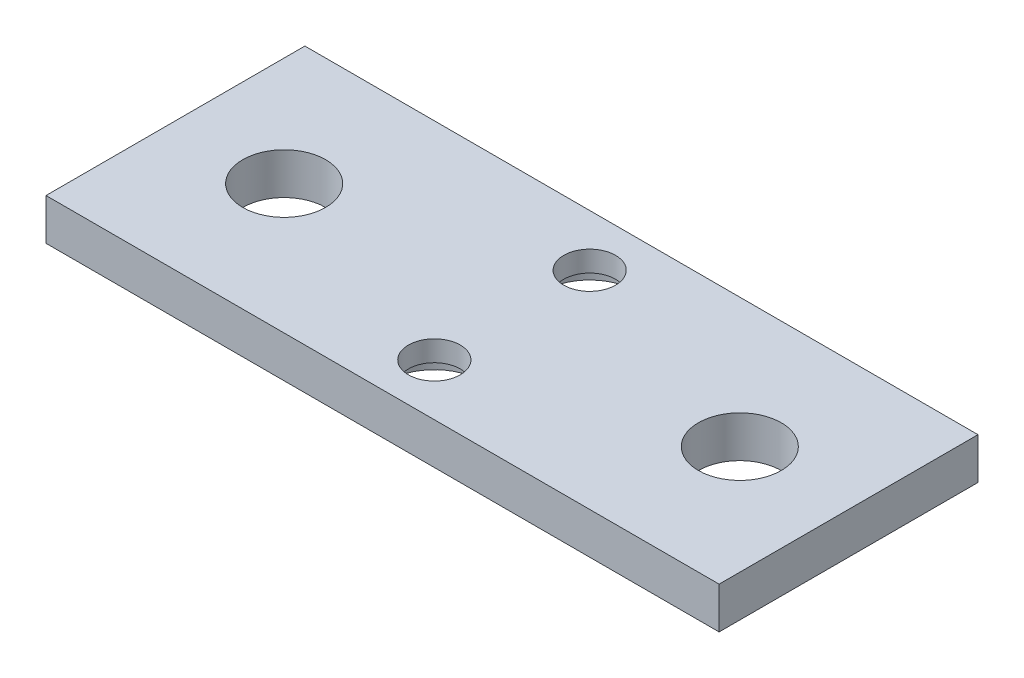
ISO-10303-21;
HEADER;
FILE_DESCRIPTION(('STEP AP214'),'2;1');
FILE_NAME('part.step','',(''),(''),'','','');
FILE_SCHEMA(('AUTOMOTIVE_DESIGN { 1 0 10303 214 1 1 1 1 }'));
ENDSEC;
DATA;
#1=APPLICATION_CONTEXT('core data for automotive mechanical design processes');
#2=APPLICATION_PROTOCOL_DEFINITION('international standard','automotive_design',2000,#1);
#3=PRODUCT_CONTEXT('',#1,'mechanical');
#4=PRODUCT('Part','Part','',(#3));
#5=PRODUCT_RELATED_PRODUCT_CATEGORY('part','',(#4));
#6=PRODUCT_DEFINITION_FORMATION('','',#4);
#7=PRODUCT_DEFINITION_CONTEXT('part definition',#1,'design');
#8=PRODUCT_DEFINITION('design','',#6,#7);
#9=PRODUCT_DEFINITION_SHAPE('','',#8);
#10=(LENGTH_UNIT() NAMED_UNIT(*) SI_UNIT(.MILLI.,.METRE.));
#11=(NAMED_UNIT(*) PLANE_ANGLE_UNIT() SI_UNIT($,.RADIAN.));
#12=(NAMED_UNIT(*) SI_UNIT($,.STERADIAN.) SOLID_ANGLE_UNIT());
#13=UNCERTAINTY_MEASURE_WITH_UNIT(LENGTH_MEASURE(1.E-05),#10,'distance_accuracy_value','');
#14=(GEOMETRIC_REPRESENTATION_CONTEXT(3) GLOBAL_UNCERTAINTY_ASSIGNED_CONTEXT((#13)) GLOBAL_UNIT_ASSIGNED_CONTEXT((#10,
#11,#12)) REPRESENTATION_CONTEXT('',''));
#15=CARTESIAN_POINT('',(0.,0.,0.));
#16=DIRECTION('',(0.,0.,1.));
#17=DIRECTION('',(1.,0.,0.));
#18=AXIS2_PLACEMENT_3D('',#15,#16,#17);
#19=CARTESIAN_POINT('',(-32.5,4.,-12.5));
#20=DIRECTION('',(0.,0.,1.));
#21=DIRECTION('',(1.,0.,0.));
#22=AXIS2_PLACEMENT_3D('',#19,#20,#21);
#23=PLANE('',#22);
#24=DIRECTION('',(0.,-1.,0.));
#25=VECTOR('',#24,1.);
#26=CARTESIAN_POINT('',(-32.5,4.,-12.5));
#27=LINE('',#26,#25);
#28=CARTESIAN_POINT('',(-32.5,4.,-12.5));
#29=VERTEX_POINT('',#28);
#30=CARTESIAN_POINT('',(-32.5,0.,-12.5));
#31=VERTEX_POINT('',#30);
#32=EDGE_CURVE('E50',#29,#31,#27,.T.);
#33=ORIENTED_EDGE('',*,*,#32,.F.);
#34=DIRECTION('',(-1.,0.,0.));
#35=VECTOR('',#34,1.);
#36=CARTESIAN_POINT('',(-32.5,4.,-12.5));
#37=LINE('',#36,#35);
#38=CARTESIAN_POINT('',(32.5,4.,-12.5));
#39=VERTEX_POINT('',#38);
#40=EDGE_CURVE('E89',#39,#29,#37,.T.);
#41=ORIENTED_EDGE('',*,*,#40,.F.);
#42=DIRECTION('',(0.,-1.,0.));
#43=VECTOR('',#42,1.);
#44=CARTESIAN_POINT('',(32.5,4.,-12.5));
#45=LINE('',#44,#43);
#46=CARTESIAN_POINT('',(32.5,0.,-12.5));
#47=VERTEX_POINT('',#46);
#48=EDGE_CURVE('E11',#39,#47,#45,.T.);
#49=ORIENTED_EDGE('',*,*,#48,.T.);
#50=DIRECTION('',(-1.,0.,0.));
#51=VECTOR('',#50,1.);
#52=CARTESIAN_POINT('',(-32.5,0.,-12.5));
#53=LINE('',#52,#51);
#54=EDGE_CURVE('E98',#47,#31,#53,.T.);
#55=ORIENTED_EDGE('',*,*,#54,.T.);
#56=EDGE_LOOP('',(#33,#41,#49,#55));
#57=FACE_BOUND('',#56,.T.);
#58=ADVANCED_FACE('F40',(#57),#23,.F.);
#59=CARTESIAN_POINT('',(-32.5,4.,12.5));
#60=DIRECTION('',(0.,0.,-1.));
#61=DIRECTION('',(-1.,0.,0.));
#62=AXIS2_PLACEMENT_3D('',#59,#60,#61);
#63=PLANE('',#62);
#64=DIRECTION('',(0.,-1.,0.));
#65=VECTOR('',#64,1.);
#66=CARTESIAN_POINT('',(32.5,4.,12.5));
#67=LINE('',#66,#65);
#68=CARTESIAN_POINT('',(32.5,4.,12.5));
#69=VERTEX_POINT('',#68);
#70=CARTESIAN_POINT('',(32.5,0.,12.5));
#71=VERTEX_POINT('',#70);
#72=EDGE_CURVE('E103',#69,#71,#67,.T.);
#73=ORIENTED_EDGE('',*,*,#72,.F.);
#74=DIRECTION('',(1.,0.,0.));
#75=VECTOR('',#74,1.);
#76=CARTESIAN_POINT('',(-32.5,4.,12.5));
#77=LINE('',#76,#75);
#78=CARTESIAN_POINT('',(-32.5,4.,12.5));
#79=VERTEX_POINT('',#78);
#80=EDGE_CURVE('E59',#79,#69,#77,.T.);
#81=ORIENTED_EDGE('',*,*,#80,.F.);
#82=DIRECTION('',(0.,-1.,0.));
#83=VECTOR('',#82,1.);
#84=CARTESIAN_POINT('',(-32.5,4.,12.5));
#85=LINE('',#84,#83);
#86=CARTESIAN_POINT('',(-32.5,0.,12.5));
#87=VERTEX_POINT('',#86);
#88=EDGE_CURVE('E99',#79,#87,#85,.T.);
#89=ORIENTED_EDGE('',*,*,#88,.T.);
#90=DIRECTION('',(1.,0.,0.));
#91=VECTOR('',#90,1.);
#92=CARTESIAN_POINT('',(-32.5,0.,12.5));
#93=LINE('',#92,#91);
#94=EDGE_CURVE('E82',#87,#71,#93,.T.);
#95=ORIENTED_EDGE('',*,*,#94,.T.);
#96=EDGE_LOOP('',(#73,#81,#89,#95));
#97=FACE_BOUND('',#96,.T.);
#98=ADVANCED_FACE('F167',(#97),#63,.F.);
#99=CARTESIAN_POINT('',(0.,17.,7.49999999999999));
#100=DIRECTION('',(0.,-1.,0.));
#101=DIRECTION('',(0.,0.,-1.));
#102=AXIS2_PLACEMENT_3D('',#99,#100,#101);
#103=CYLINDRICAL_SURFACE('',#102,2.5);
#104=CARTESIAN_POINT('',(0.,4.,7.49999999999999));
#105=DIRECTION('',(0.,-1.,0.));
#106=DIRECTION('',(0.,0.,-1.));
#107=AXIS2_PLACEMENT_3D('',#104,#105,#106);
#108=CIRCLE('',#107,2.5);
#109=CARTESIAN_POINT('',(0.,4.,4.99999999999999));
#110=VERTEX_POINT('',#109);
#111=EDGE_CURVE('E131',#110,#110,#108,.F.);
#112=ORIENTED_EDGE('',*,*,#111,.T.);
#113=EDGE_LOOP('',(#112));
#114=FACE_BOUND('',#113,.T.);
#115=CARTESIAN_POINT('',(0.,2.,7.49999999999999));
#116=DIRECTION('',(0.,-1.,0.));
#117=DIRECTION('',(0.,0.,-1.));
#118=AXIS2_PLACEMENT_3D('',#115,#116,#117);
#119=CIRCLE('',#118,2.5);
#120=CARTESIAN_POINT('',(0.,2.,4.99999999999999));
#121=VERTEX_POINT('',#120);
#122=EDGE_CURVE('E44',#121,#121,#119,.F.);
#123=ORIENTED_EDGE('',*,*,#122,.F.);
#124=EDGE_LOOP('',(#123));
#125=FACE_BOUND('',#124,.T.);
#126=ADVANCED_FACE('F172',(#114,#125),#103,.F.);
#127=CARTESIAN_POINT('',(0.,17.,-7.49999999999999));
#128=DIRECTION('',(0.,-1.,0.));
#129=DIRECTION('',(0.,0.,-1.));
#130=AXIS2_PLACEMENT_3D('',#127,#128,#129);
#131=CYLINDRICAL_SURFACE('',#130,2.5);
#132=CARTESIAN_POINT('',(0.,4.,-7.49999999999999));
#133=DIRECTION('',(0.,-1.,0.));
#134=DIRECTION('',(0.,0.,-1.));
#135=AXIS2_PLACEMENT_3D('',#132,#133,#134);
#136=CIRCLE('',#135,2.5);
#137=CARTESIAN_POINT('',(0.,4.,-9.99999999999999));
#138=VERTEX_POINT('',#137);
#139=EDGE_CURVE('E338',#138,#138,#136,.F.);
#140=ORIENTED_EDGE('',*,*,#139,.T.);
#141=EDGE_LOOP('',(#140));
#142=FACE_BOUND('',#141,.T.);
#143=CARTESIAN_POINT('',(0.,2.,-7.49999999999999));
#144=DIRECTION('',(0.,-1.,0.));
#145=DIRECTION('',(0.,0.,-1.));
#146=AXIS2_PLACEMENT_3D('',#143,#144,#145);
#147=CIRCLE('',#146,2.5);
#148=CARTESIAN_POINT('',(0.,2.,-9.99999999999999));
#149=VERTEX_POINT('',#148);
#150=EDGE_CURVE('E115',#149,#149,#147,.F.);
#151=ORIENTED_EDGE('',*,*,#150,.F.);
#152=EDGE_LOOP('',(#151));
#153=FACE_BOUND('',#152,.T.);
#154=ADVANCED_FACE('F177',(#142,#153),#131,.F.);
#155=CARTESIAN_POINT('',(32.5,4.,-12.5));
#156=DIRECTION('',(-1.,0.,0.));
#157=DIRECTION('',(0.,0.,1.));
#158=AXIS2_PLACEMENT_3D('',#155,#156,#157);
#159=PLANE('',#158);
#160=DIRECTION('',(0.,0.,-1.));
#161=VECTOR('',#160,1.);
#162=CARTESIAN_POINT('',(32.5,0.,-12.5));
#163=LINE('',#162,#161);
#164=EDGE_CURVE('E107',#71,#47,#163,.T.);
#165=ORIENTED_EDGE('',*,*,#164,.T.);
#166=ORIENTED_EDGE('',*,*,#48,.F.);
#167=DIRECTION('',(0.,0.,-1.));
#168=VECTOR('',#167,1.);
#169=CARTESIAN_POINT('',(32.5,4.,-12.5));
#170=LINE('',#169,#168);
#171=EDGE_CURVE('E95',#69,#39,#170,.T.);
#172=ORIENTED_EDGE('',*,*,#171,.F.);
#173=ORIENTED_EDGE('',*,*,#72,.T.);
#174=EDGE_LOOP('',(#165,#166,#172,#173));
#175=FACE_BOUND('',#174,.T.);
#176=ADVANCED_FACE('F42',(#175),#159,.F.);
#177=CARTESIAN_POINT('',(-32.5,4.,-12.5));
#178=DIRECTION('',(1.,0.,0.));
#179=DIRECTION('',(0.,0.,-1.));
#180=AXIS2_PLACEMENT_3D('',#177,#178,#179);
#181=PLANE('',#180);
#182=DIRECTION('',(0.,0.,1.));
#183=VECTOR('',#182,1.);
#184=CARTESIAN_POINT('',(-32.5,0.,-12.5));
#185=LINE('',#184,#183);
#186=EDGE_CURVE('E76',#31,#87,#185,.T.);
#187=ORIENTED_EDGE('',*,*,#186,.T.);
#188=ORIENTED_EDGE('',*,*,#88,.F.);
#189=DIRECTION('',(0.,0.,1.));
#190=VECTOR('',#189,1.);
#191=CARTESIAN_POINT('',(-32.5,4.,-12.5));
#192=LINE('',#191,#190);
#193=EDGE_CURVE('E93',#29,#79,#192,.T.);
#194=ORIENTED_EDGE('',*,*,#193,.F.);
#195=ORIENTED_EDGE('',*,*,#32,.T.);
#196=EDGE_LOOP('',(#187,#188,#194,#195));
#197=FACE_BOUND('',#196,.T.);
#198=ADVANCED_FACE('F101',(#197),#181,.F.);
#199=CARTESIAN_POINT('',(0.,4.,0.));
#200=DIRECTION('',(0.,1.,0.));
#201=DIRECTION('',(0.,0.,1.));
#202=AXIS2_PLACEMENT_3D('',#199,#200,#201);
#203=PLANE('',#202);
#204=CARTESIAN_POINT('',(-22.,4.,0.));
#205=DIRECTION('',(0.,1.,0.));
#206=DIRECTION('',(0.,0.,1.));
#207=AXIS2_PLACEMENT_3D('',#204,#205,#206);
#208=CIRCLE('',#207,4.);
#209=CARTESIAN_POINT('',(-22.,4.,4.));
#210=VERTEX_POINT('',#209);
#211=EDGE_CURVE('E110',#210,#210,#208,.T.);
#212=ORIENTED_EDGE('',*,*,#211,.F.);
#213=EDGE_LOOP('',(#212));
#214=FACE_BOUND('',#213,.T.);
#215=ORIENTED_EDGE('',*,*,#80,.T.);
#216=ORIENTED_EDGE('',*,*,#171,.T.);
#217=ORIENTED_EDGE('',*,*,#40,.T.);
#218=ORIENTED_EDGE('',*,*,#193,.T.);
#219=EDGE_LOOP('',(#215,#216,#217,#218));
#220=FACE_BOUND('',#219,.T.);
#221=ORIENTED_EDGE('',*,*,#139,.F.);
#222=EDGE_LOOP('',(#221));
#223=FACE_BOUND('',#222,.T.);
#224=ORIENTED_EDGE('',*,*,#111,.F.);
#225=EDGE_LOOP('',(#224));
#226=FACE_BOUND('',#225,.T.);
#227=CARTESIAN_POINT('',(22.,4.,0.));
#228=DIRECTION('',(0.,1.,0.));
#229=DIRECTION('',(0.,0.,1.));
#230=AXIS2_PLACEMENT_3D('',#227,#228,#229);
#231=CIRCLE('',#230,4.);
#232=CARTESIAN_POINT('',(22.,4.,4.));
#233=VERTEX_POINT('',#232);
#234=EDGE_CURVE('E142',#233,#233,#231,.T.);
#235=ORIENTED_EDGE('',*,*,#234,.F.);
#236=EDGE_LOOP('',(#235));
#237=FACE_BOUND('',#236,.T.);
#238=ADVANCED_FACE('F90',(#214,#220,#223,#226,#237),#203,.T.);
#239=CARTESIAN_POINT('',(0.,0.,0.));
#240=DIRECTION('',(0.,1.,0.));
#241=DIRECTION('',(0.,0.,1.));
#242=AXIS2_PLACEMENT_3D('',#239,#240,#241);
#243=PLANE('',#242);
#244=CARTESIAN_POINT('',(0.,0.,-7.49999999999999));
#245=DIRECTION('',(0.,-1.,0.));
#246=DIRECTION('',(0.,0.,-1.));
#247=AXIS2_PLACEMENT_3D('',#244,#245,#246);
#248=CIRCLE('',#247,4.5);
#249=CARTESIAN_POINT('',(0.,0.,-12.));
#250=VERTEX_POINT('',#249);
#251=EDGE_CURVE('E123',#250,#250,#248,.T.);
#252=ORIENTED_EDGE('',*,*,#251,.F.);
#253=EDGE_LOOP('',(#252));
#254=FACE_BOUND('',#253,.T.);
#255=CARTESIAN_POINT('',(0.,0.,7.49999999999999));
#256=DIRECTION('',(0.,-1.,0.));
#257=DIRECTION('',(0.,0.,-1.));
#258=AXIS2_PLACEMENT_3D('',#255,#256,#257);
#259=CIRCLE('',#258,4.5);
#260=CARTESIAN_POINT('',(0.,0.,2.99999999999999));
#261=VERTEX_POINT('',#260);
#262=EDGE_CURVE('E128',#261,#261,#259,.T.);
#263=ORIENTED_EDGE('',*,*,#262,.F.);
#264=EDGE_LOOP('',(#263));
#265=FACE_BOUND('',#264,.T.);
#266=CARTESIAN_POINT('',(-22.,0.,0.));
#267=DIRECTION('',(0.,-1.,0.));
#268=DIRECTION('',(0.,0.,-1.));
#269=AXIS2_PLACEMENT_3D('',#266,#267,#268);
#270=CIRCLE('',#269,4.);
#271=CARTESIAN_POINT('',(-22.,0.,-4.));
#272=VERTEX_POINT('',#271);
#273=EDGE_CURVE('E139',#272,#272,#270,.T.);
#274=ORIENTED_EDGE('',*,*,#273,.F.);
#275=EDGE_LOOP('',(#274));
#276=FACE_BOUND('',#275,.T.);
#277=CARTESIAN_POINT('',(22.,0.,0.));
#278=DIRECTION('',(0.,-1.,0.));
#279=DIRECTION('',(0.,0.,1.));
#280=AXIS2_PLACEMENT_3D('',#277,#278,#279);
#281=CIRCLE('',#280,4.);
#282=CARTESIAN_POINT('',(22.,0.,4.));
#283=VERTEX_POINT('',#282);
#284=EDGE_CURVE('E121',#283,#283,#281,.T.);
#285=ORIENTED_EDGE('',*,*,#284,.F.);
#286=EDGE_LOOP('',(#285));
#287=FACE_BOUND('',#286,.T.);
#288=ORIENTED_EDGE('',*,*,#164,.F.);
#289=ORIENTED_EDGE('',*,*,#94,.F.);
#290=ORIENTED_EDGE('',*,*,#186,.F.);
#291=ORIENTED_EDGE('',*,*,#54,.F.);
#292=EDGE_LOOP('',(#288,#289,#290,#291));
#293=FACE_BOUND('',#292,.T.);
#294=ADVANCED_FACE('F154',(#254,#265,#276,#287,#293),#243,.F.);
#295=CARTESIAN_POINT('',(22.,17.,0.));
#296=DIRECTION('',(0.,-1.,0.));
#297=DIRECTION('',(0.,0.,-1.));
#298=AXIS2_PLACEMENT_3D('',#295,#296,#297);
#299=CYLINDRICAL_SURFACE('',#298,4.);
#300=ORIENTED_EDGE('',*,*,#234,.T.);
#301=EDGE_LOOP('',(#300));
#302=FACE_BOUND('',#301,.T.);
#303=ORIENTED_EDGE('',*,*,#284,.T.);
#304=EDGE_LOOP('',(#303));
#305=FACE_BOUND('',#304,.T.);
#306=ADVANCED_FACE('F160',(#302,#305),#299,.F.);
#307=CARTESIAN_POINT('',(-22.,17.,0.));
#308=DIRECTION('',(0.,-1.,0.));
#309=DIRECTION('',(0.,0.,-1.));
#310=AXIS2_PLACEMENT_3D('',#307,#308,#309);
#311=CYLINDRICAL_SURFACE('',#310,4.);
#312=ORIENTED_EDGE('',*,*,#211,.T.);
#313=EDGE_LOOP('',(#312));
#314=FACE_BOUND('',#313,.T.);
#315=ORIENTED_EDGE('',*,*,#273,.T.);
#316=EDGE_LOOP('',(#315));
#317=FACE_BOUND('',#316,.T.);
#318=ADVANCED_FACE('F150',(#314,#317),#311,.F.);
#319=CARTESIAN_POINT('',(0.,2.,-7.49999999999999));
#320=DIRECTION('',(0.,-1.,0.));
#321=DIRECTION('',(0.,0.,-1.));
#322=AXIS2_PLACEMENT_3D('',#319,#320,#321);
#323=PLANE('',#322);
#324=CARTESIAN_POINT('',(0.,2.,-7.49999999999999));
#325=DIRECTION('',(0.,-1.,0.));
#326=DIRECTION('',(0.,0.,-1.));
#327=AXIS2_PLACEMENT_3D('',#324,#325,#326);
#328=CIRCLE('',#327,4.5);
#329=CARTESIAN_POINT('',(0.,2.,-12.));
#330=VERTEX_POINT('',#329);
#331=EDGE_CURVE('E117',#330,#330,#328,.T.);
#332=ORIENTED_EDGE('',*,*,#331,.T.);
#333=EDGE_LOOP('',(#332));
#334=FACE_BOUND('',#333,.T.);
#335=ORIENTED_EDGE('',*,*,#150,.T.);
#336=EDGE_LOOP('',(#335));
#337=FACE_BOUND('',#336,.T.);
#338=ADVANCED_FACE('F198',(#334,#337),#323,.T.);
#339=CARTESIAN_POINT('',(0.,2.,-7.49999999999999));
#340=DIRECTION('',(0.,-1.,0.));
#341=DIRECTION('',(0.,0.,-1.));
#342=AXIS2_PLACEMENT_3D('',#339,#340,#341);
#343=CYLINDRICAL_SURFACE('',#342,4.5);
#344=ORIENTED_EDGE('',*,*,#331,.F.);
#345=EDGE_LOOP('',(#344));
#346=FACE_BOUND('',#345,.T.);
#347=ORIENTED_EDGE('',*,*,#251,.T.);
#348=EDGE_LOOP('',(#347));
#349=FACE_BOUND('',#348,.T.);
#350=ADVANCED_FACE('F221',(#346,#349),#343,.F.);
#351=CARTESIAN_POINT('',(0.,2.,7.49999999999999));
#352=DIRECTION('',(0.,-1.,0.));
#353=DIRECTION('',(0.,0.,-1.));
#354=AXIS2_PLACEMENT_3D('',#351,#352,#353);
#355=PLANE('',#354);
#356=CARTESIAN_POINT('',(0.,2.,7.49999999999999));
#357=DIRECTION('',(0.,-1.,0.));
#358=DIRECTION('',(0.,0.,-1.));
#359=AXIS2_PLACEMENT_3D('',#356,#357,#358);
#360=CIRCLE('',#359,4.5);
#361=CARTESIAN_POINT('',(0.,2.,2.99999999999999));
#362=VERTEX_POINT('',#361);
#363=EDGE_CURVE('E136',#362,#362,#360,.T.);
#364=ORIENTED_EDGE('',*,*,#363,.T.);
#365=EDGE_LOOP('',(#364));
#366=FACE_BOUND('',#365,.T.);
#367=ORIENTED_EDGE('',*,*,#122,.T.);
#368=EDGE_LOOP('',(#367));
#369=FACE_BOUND('',#368,.T.);
#370=ADVANCED_FACE('F194',(#366,#369),#355,.T.);
#371=CARTESIAN_POINT('',(0.,2.,7.49999999999999));
#372=DIRECTION('',(0.,-1.,0.));
#373=DIRECTION('',(0.,0.,-1.));
#374=AXIS2_PLACEMENT_3D('',#371,#372,#373);
#375=CYLINDRICAL_SURFACE('',#374,4.5);
#376=ORIENTED_EDGE('',*,*,#363,.F.);
#377=EDGE_LOOP('',(#376));
#378=FACE_BOUND('',#377,.T.);
#379=ORIENTED_EDGE('',*,*,#262,.T.);
#380=EDGE_LOOP('',(#379));
#381=FACE_BOUND('',#380,.T.);
#382=ADVANCED_FACE('F234',(#378,#381),#375,.F.);
#383=CLOSED_SHELL('',(#58,#98,#126,#154,#176,#198,#238,#294,#306,#318,#338,#350,#370,#382));
#384=MANIFOLD_SOLID_BREP('B2',#383);
#385=ADVANCED_BREP_SHAPE_REPRESENTATION('',(#18,#384),#14);
#386=SHAPE_DEFINITION_REPRESENTATION(#9,#385);
ENDSEC;
END-ISO-10303-21;
